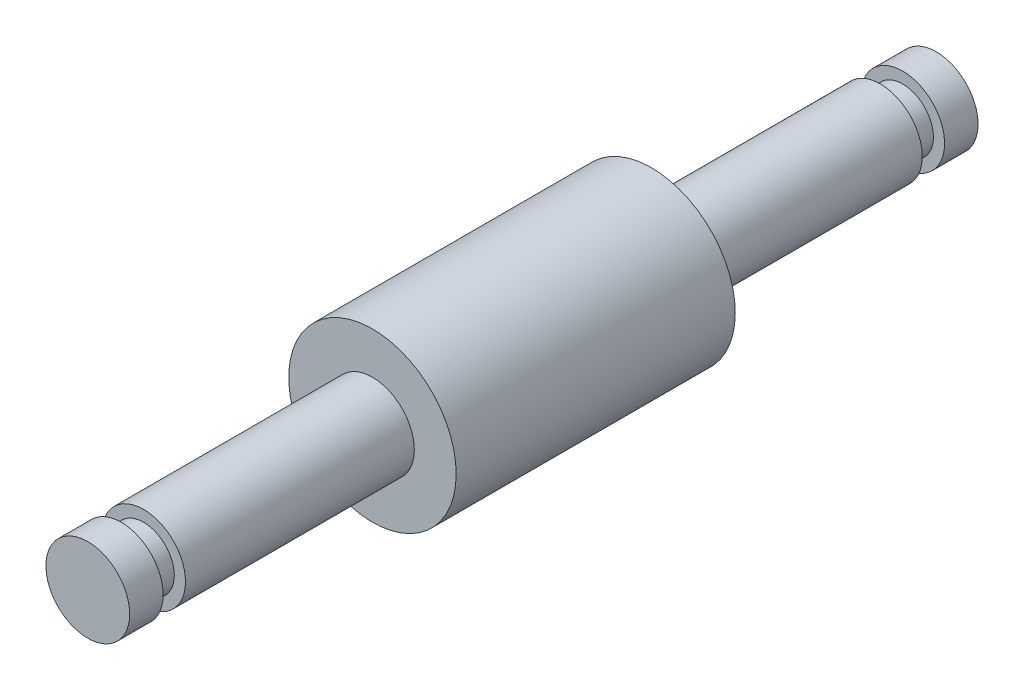
ISO-10303-21;
HEADER;
FILE_DESCRIPTION(('STEP AP214'),'2;1');
FILE_NAME('part.step','',(''),(''),'','','');
FILE_SCHEMA(('AUTOMOTIVE_DESIGN { 1 0 10303 214 1 1 1 1 }'));
ENDSEC;
DATA;
#1=APPLICATION_CONTEXT('core data for automotive mechanical design processes');
#2=APPLICATION_PROTOCOL_DEFINITION('international standard','automotive_design',2000,#1);
#3=PRODUCT_CONTEXT('',#1,'mechanical');
#4=PRODUCT('Part','Part','',(#3));
#5=PRODUCT_RELATED_PRODUCT_CATEGORY('part','',(#4));
#6=PRODUCT_DEFINITION_FORMATION('','',#4);
#7=PRODUCT_DEFINITION_CONTEXT('part definition',#1,'design');
#8=PRODUCT_DEFINITION('design','',#6,#7);
#9=PRODUCT_DEFINITION_SHAPE('','',#8);
#10=(LENGTH_UNIT() NAMED_UNIT(*) SI_UNIT(.MILLI.,.METRE.));
#11=(NAMED_UNIT(*) PLANE_ANGLE_UNIT() SI_UNIT($,.RADIAN.));
#12=(NAMED_UNIT(*) SI_UNIT($,.STERADIAN.) SOLID_ANGLE_UNIT());
#13=UNCERTAINTY_MEASURE_WITH_UNIT(LENGTH_MEASURE(1.E-05),#10,'distance_accuracy_value','');
#14=(GEOMETRIC_REPRESENTATION_CONTEXT(3) GLOBAL_UNCERTAINTY_ASSIGNED_CONTEXT((#13)) GLOBAL_UNIT_ASSIGNED_CONTEXT((#10,
#11,#12)) REPRESENTATION_CONTEXT('',''));
#15=CARTESIAN_POINT('',(0.,0.,0.));
#16=DIRECTION('',(0.,0.,1.));
#17=DIRECTION('',(1.,0.,0.));
#18=AXIS2_PLACEMENT_3D('',#15,#16,#17);
#19=CARTESIAN_POINT('',(0.,0.,25.));
#20=DIRECTION('',(0.,0.,-1.));
#21=DIRECTION('',(-1.,0.,0.));
#22=AXIS2_PLACEMENT_3D('',#19,#20,#21);
#23=CYLINDRICAL_SURFACE('',#22,15.);
#24=CARTESIAN_POINT('',(0.,0.,25.));
#25=DIRECTION('',(0.,0.,1.));
#26=DIRECTION('',(1.,0.,0.));
#27=AXIS2_PLACEMENT_3D('',#24,#25,#26);
#28=CIRCLE('',#27,15.);
#29=CARTESIAN_POINT('',(15.,0.,25.));
#30=VERTEX_POINT('',#29);
#31=EDGE_CURVE('E89',#30,#30,#28,.T.);
#32=ORIENTED_EDGE('',*,*,#31,.F.);
#33=EDGE_LOOP('',(#32));
#34=FACE_BOUND('',#33,.T.);
#35=CARTESIAN_POINT('',(0.,0.,-25.));
#36=DIRECTION('',(0.,0.,1.));
#37=DIRECTION('',(1.,0.,0.));
#38=AXIS2_PLACEMENT_3D('',#35,#36,#37);
#39=CIRCLE('',#38,15.);
#40=CARTESIAN_POINT('',(15.,0.,-25.));
#41=VERTEX_POINT('',#40);
#42=EDGE_CURVE('E46',#41,#41,#39,.T.);
#43=ORIENTED_EDGE('',*,*,#42,.T.);
#44=EDGE_LOOP('',(#43));
#45=FACE_BOUND('',#44,.T.);
#46=ADVANCED_FACE('F43',(#34,#45),#23,.T.);
#47=CARTESIAN_POINT('',(0.,0.,25.));
#48=DIRECTION('',(0.,0.,1.));
#49=DIRECTION('',(1.,0.,0.));
#50=AXIS2_PLACEMENT_3D('',#47,#48,#49);
#51=PLANE('',#50);
#52=CARTESIAN_POINT('',(0.,0.,25.));
#53=DIRECTION('',(0.,0.,1.));
#54=DIRECTION('',(1.,0.,0.));
#55=AXIS2_PLACEMENT_3D('',#52,#53,#54);
#56=CIRCLE('',#55,7.5);
#57=CARTESIAN_POINT('',(7.5,0.,25.));
#58=VERTEX_POINT('',#57);
#59=EDGE_CURVE('E83',#58,#58,#56,.T.);
#60=ORIENTED_EDGE('',*,*,#59,.F.);
#61=EDGE_LOOP('',(#60));
#62=FACE_BOUND('',#61,.T.);
#63=ORIENTED_EDGE('',*,*,#31,.T.);
#64=EDGE_LOOP('',(#63));
#65=FACE_BOUND('',#64,.T.);
#66=ADVANCED_FACE('F102',(#62,#65),#51,.T.);
#67=CARTESIAN_POINT('',(0.,0.,-25.));
#68=DIRECTION('',(0.,0.,1.));
#69=DIRECTION('',(1.,0.,0.));
#70=AXIS2_PLACEMENT_3D('',#67,#68,#69);
#71=PLANE('',#70);
#72=CARTESIAN_POINT('',(0.,0.,-25.));
#73=DIRECTION('',(0.,0.,-1.));
#74=DIRECTION('',(-1.,0.,0.));
#75=AXIS2_PLACEMENT_3D('',#72,#73,#74);
#76=CIRCLE('',#75,7.5);
#77=CARTESIAN_POINT('',(-7.5,0.,-25.));
#78=VERTEX_POINT('',#77);
#79=EDGE_CURVE('E51',#78,#78,#76,.T.);
#80=ORIENTED_EDGE('',*,*,#79,.F.);
#81=EDGE_LOOP('',(#80));
#82=FACE_BOUND('',#81,.T.);
#83=ORIENTED_EDGE('',*,*,#42,.F.);
#84=EDGE_LOOP('',(#83));
#85=FACE_BOUND('',#84,.T.);
#86=ADVANCED_FACE('F99',(#82,#85),#71,.F.);
#87=CARTESIAN_POINT('',(0.,0.,66.));
#88=DIRECTION('',(0.,0.,-1.));
#89=DIRECTION('',(-1.,0.,0.));
#90=AXIS2_PLACEMENT_3D('',#87,#88,#89);
#91=CYLINDRICAL_SURFACE('',#90,7.5);
#92=CARTESIAN_POINT('',(0.,0.,66.));
#93=DIRECTION('',(0.,0.,1.));
#94=DIRECTION('',(1.,0.,0.));
#95=AXIS2_PLACEMENT_3D('',#92,#93,#94);
#96=CIRCLE('',#95,7.5);
#97=CARTESIAN_POINT('',(7.5,0.,66.));
#98=VERTEX_POINT('',#97);
#99=EDGE_CURVE('E79',#98,#98,#96,.T.);
#100=ORIENTED_EDGE('',*,*,#99,.F.);
#101=EDGE_LOOP('',(#100));
#102=FACE_BOUND('',#101,.T.);
#103=ORIENTED_EDGE('',*,*,#59,.T.);
#104=EDGE_LOOP('',(#103));
#105=FACE_BOUND('',#104,.T.);
#106=ADVANCED_FACE('F101',(#102,#105),#91,.T.);
#107=CARTESIAN_POINT('',(0.,0.,66.));
#108=DIRECTION('',(0.,0.,1.));
#109=DIRECTION('',(1.,0.,0.));
#110=AXIS2_PLACEMENT_3D('',#107,#108,#109);
#111=PLANE('',#110);
#112=CARTESIAN_POINT('',(0.,0.,66.));
#113=DIRECTION('',(0.,0.,1.));
#114=DIRECTION('',(1.,0.,0.));
#115=AXIS2_PLACEMENT_3D('',#112,#113,#114);
#116=CIRCLE('',#115,5.5);
#117=CARTESIAN_POINT('',(5.5,0.,66.));
#118=VERTEX_POINT('',#117);
#119=EDGE_CURVE('E57',#118,#118,#116,.T.);
#120=ORIENTED_EDGE('',*,*,#119,.F.);
#121=EDGE_LOOP('',(#120));
#122=FACE_BOUND('',#121,.T.);
#123=ORIENTED_EDGE('',*,*,#99,.T.);
#124=EDGE_LOOP('',(#123));
#125=FACE_BOUND('',#124,.T.);
#126=ADVANCED_FACE('F109',(#122,#125),#111,.T.);
#127=CARTESIAN_POINT('',(0.,0.,70.));
#128=DIRECTION('',(0.,0.,-1.));
#129=DIRECTION('',(-1.,0.,0.));
#130=AXIS2_PLACEMENT_3D('',#127,#128,#129);
#131=CYLINDRICAL_SURFACE('',#130,5.5);
#132=CARTESIAN_POINT('',(0.,0.,70.));
#133=DIRECTION('',(0.,0.,1.));
#134=DIRECTION('',(1.,0.,0.));
#135=AXIS2_PLACEMENT_3D('',#132,#133,#134);
#136=CIRCLE('',#135,5.5);
#137=CARTESIAN_POINT('',(5.5,0.,70.));
#138=VERTEX_POINT('',#137);
#139=EDGE_CURVE('E72',#138,#138,#136,.T.);
#140=ORIENTED_EDGE('',*,*,#139,.F.);
#141=EDGE_LOOP('',(#140));
#142=FACE_BOUND('',#141,.T.);
#143=ORIENTED_EDGE('',*,*,#119,.T.);
#144=EDGE_LOOP('',(#143));
#145=FACE_BOUND('',#144,.T.);
#146=ADVANCED_FACE('F137',(#142,#145),#131,.T.);
#147=CARTESIAN_POINT('',(0.,0.,76.));
#148=DIRECTION('',(0.,0.,-1.));
#149=DIRECTION('',(-1.,0.,0.));
#150=AXIS2_PLACEMENT_3D('',#147,#148,#149);
#151=CYLINDRICAL_SURFACE('',#150,7.5);
#152=CARTESIAN_POINT('',(0.,0.,76.));
#153=DIRECTION('',(0.,0.,1.));
#154=DIRECTION('',(1.,0.,0.));
#155=AXIS2_PLACEMENT_3D('',#152,#153,#154);
#156=CIRCLE('',#155,7.5);
#157=CARTESIAN_POINT('',(7.5,0.,76.));
#158=VERTEX_POINT('',#157);
#159=EDGE_CURVE('E68',#158,#158,#156,.T.);
#160=ORIENTED_EDGE('',*,*,#159,.F.);
#161=EDGE_LOOP('',(#160));
#162=FACE_BOUND('',#161,.T.);
#163=CARTESIAN_POINT('',(0.,0.,70.));
#164=DIRECTION('',(0.,0.,1.));
#165=DIRECTION('',(1.,0.,0.));
#166=AXIS2_PLACEMENT_3D('',#163,#164,#165);
#167=CIRCLE('',#166,7.5);
#168=CARTESIAN_POINT('',(7.5,0.,70.));
#169=VERTEX_POINT('',#168);
#170=EDGE_CURVE('E66',#169,#169,#167,.T.);
#171=ORIENTED_EDGE('',*,*,#170,.T.);
#172=EDGE_LOOP('',(#171));
#173=FACE_BOUND('',#172,.T.);
#174=ADVANCED_FACE('F146',(#162,#173),#151,.T.);
#175=CARTESIAN_POINT('',(0.,0.,76.));
#176=DIRECTION('',(0.,0.,1.));
#177=DIRECTION('',(1.,0.,0.));
#178=AXIS2_PLACEMENT_3D('',#175,#176,#177);
#179=PLANE('',#178);
#180=ORIENTED_EDGE('',*,*,#159,.T.);
#181=EDGE_LOOP('',(#180));
#182=FACE_BOUND('',#181,.T.);
#183=ADVANCED_FACE('F155',(#182),#179,.T.);
#184=CARTESIAN_POINT('',(0.,0.,70.));
#185=DIRECTION('',(0.,0.,1.));
#186=DIRECTION('',(1.,0.,0.));
#187=AXIS2_PLACEMENT_3D('',#184,#185,#186);
#188=PLANE('',#187);
#189=ORIENTED_EDGE('',*,*,#139,.T.);
#190=EDGE_LOOP('',(#189));
#191=FACE_BOUND('',#190,.T.);
#192=ORIENTED_EDGE('',*,*,#170,.F.);
#193=EDGE_LOOP('',(#192));
#194=FACE_BOUND('',#193,.T.);
#195=ADVANCED_FACE('F163',(#191,#194),#188,.F.);
#196=CARTESIAN_POINT('',(0.,0.,-66.));
#197=DIRECTION('',(0.,0.,1.));
#198=DIRECTION('',(1.,0.,0.));
#199=AXIS2_PLACEMENT_3D('',#196,#197,#198);
#200=CYLINDRICAL_SURFACE('',#199,7.5);
#201=CARTESIAN_POINT('',(0.,0.,-66.));
#202=DIRECTION('',(0.,0.,-1.));
#203=DIRECTION('',(-1.,0.,0.));
#204=AXIS2_PLACEMENT_3D('',#201,#202,#203);
#205=CIRCLE('',#204,7.5);
#206=CARTESIAN_POINT('',(-7.5,0.,-66.));
#207=VERTEX_POINT('',#206);
#208=EDGE_CURVE('E63',#207,#207,#205,.T.);
#209=ORIENTED_EDGE('',*,*,#208,.F.);
#210=EDGE_LOOP('',(#209));
#211=FACE_BOUND('',#210,.T.);
#212=ORIENTED_EDGE('',*,*,#79,.T.);
#213=EDGE_LOOP('',(#212));
#214=FACE_BOUND('',#213,.T.);
#215=ADVANCED_FACE('F171',(#211,#214),#200,.T.);
#216=CARTESIAN_POINT('',(0.,0.,-66.));
#217=DIRECTION('',(0.,0.,-1.));
#218=DIRECTION('',(-1.,0.,0.));
#219=AXIS2_PLACEMENT_3D('',#216,#217,#218);
#220=PLANE('',#219);
#221=CARTESIAN_POINT('',(0.,0.,-66.));
#222=DIRECTION('',(0.,0.,-1.));
#223=DIRECTION('',(-1.,0.,0.));
#224=AXIS2_PLACEMENT_3D('',#221,#222,#223);
#225=CIRCLE('',#224,5.5);
#226=CARTESIAN_POINT('',(-5.5,0.,-66.));
#227=VERTEX_POINT('',#226);
#228=EDGE_CURVE('E10',#227,#227,#225,.T.);
#229=ORIENTED_EDGE('',*,*,#228,.F.);
#230=EDGE_LOOP('',(#229));
#231=FACE_BOUND('',#230,.T.);
#232=ORIENTED_EDGE('',*,*,#208,.T.);
#233=EDGE_LOOP('',(#232));
#234=FACE_BOUND('',#233,.T.);
#235=ADVANCED_FACE('F183',(#231,#234),#220,.T.);
#236=CARTESIAN_POINT('',(0.,0.,-70.));
#237=DIRECTION('',(0.,0.,1.));
#238=DIRECTION('',(1.,0.,0.));
#239=AXIS2_PLACEMENT_3D('',#236,#237,#238);
#240=CYLINDRICAL_SURFACE('',#239,5.5);
#241=CARTESIAN_POINT('',(0.,0.,-70.));
#242=DIRECTION('',(0.,0.,-1.));
#243=DIRECTION('',(-1.,0.,0.));
#244=AXIS2_PLACEMENT_3D('',#241,#242,#243);
#245=CIRCLE('',#244,5.5);
#246=CARTESIAN_POINT('',(-5.5,0.,-70.));
#247=VERTEX_POINT('',#246);
#248=EDGE_CURVE('E61',#247,#247,#245,.T.);
#249=ORIENTED_EDGE('',*,*,#248,.F.);
#250=EDGE_LOOP('',(#249));
#251=FACE_BOUND('',#250,.T.);
#252=ORIENTED_EDGE('',*,*,#228,.T.);
#253=EDGE_LOOP('',(#252));
#254=FACE_BOUND('',#253,.T.);
#255=ADVANCED_FACE('F193',(#251,#254),#240,.T.);
#256=CARTESIAN_POINT('',(0.,0.,-76.));
#257=DIRECTION('',(0.,0.,1.));
#258=DIRECTION('',(1.,0.,0.));
#259=AXIS2_PLACEMENT_3D('',#256,#257,#258);
#260=CYLINDRICAL_SURFACE('',#259,7.5);
#261=CARTESIAN_POINT('',(0.,0.,-76.));
#262=DIRECTION('',(0.,0.,-1.));
#263=DIRECTION('',(-1.,0.,0.));
#264=AXIS2_PLACEMENT_3D('',#261,#262,#263);
#265=CIRCLE('',#264,7.5);
#266=CARTESIAN_POINT('',(-7.5,0.,-76.));
#267=VERTEX_POINT('',#266);
#268=EDGE_CURVE('E244',#267,#267,#265,.T.);
#269=ORIENTED_EDGE('',*,*,#268,.F.);
#270=EDGE_LOOP('',(#269));
#271=FACE_BOUND('',#270,.T.);
#272=CARTESIAN_POINT('',(0.,0.,-70.));
#273=DIRECTION('',(0.,0.,-1.));
#274=DIRECTION('',(-1.,0.,0.));
#275=AXIS2_PLACEMENT_3D('',#272,#273,#274);
#276=CIRCLE('',#275,7.5);
#277=CARTESIAN_POINT('',(-7.5,0.,-70.));
#278=VERTEX_POINT('',#277);
#279=EDGE_CURVE('E241',#278,#278,#276,.T.);
#280=ORIENTED_EDGE('',*,*,#279,.T.);
#281=EDGE_LOOP('',(#280));
#282=FACE_BOUND('',#281,.T.);
#283=ADVANCED_FACE('F203',(#271,#282),#260,.T.);
#284=CARTESIAN_POINT('',(0.,0.,-76.));
#285=DIRECTION('',(0.,0.,-1.));
#286=DIRECTION('',(-1.,0.,0.));
#287=AXIS2_PLACEMENT_3D('',#284,#285,#286);
#288=PLANE('',#287);
#289=ORIENTED_EDGE('',*,*,#268,.T.);
#290=EDGE_LOOP('',(#289));
#291=FACE_BOUND('',#290,.T.);
#292=ADVANCED_FACE('F213',(#291),#288,.T.);
#293=CARTESIAN_POINT('',(0.,0.,-70.));
#294=DIRECTION('',(0.,0.,-1.));
#295=DIRECTION('',(-1.,0.,0.));
#296=AXIS2_PLACEMENT_3D('',#293,#294,#295);
#297=PLANE('',#296);
#298=ORIENTED_EDGE('',*,*,#248,.T.);
#299=EDGE_LOOP('',(#298));
#300=FACE_BOUND('',#299,.T.);
#301=ORIENTED_EDGE('',*,*,#279,.F.);
#302=EDGE_LOOP('',(#301));
#303=FACE_BOUND('',#302,.T.);
#304=ADVANCED_FACE('F223',(#300,#303),#297,.F.);
#305=CLOSED_SHELL('',(#46,#66,#86,#106,#126,#146,#174,#183,#195,#215,#235,#255,#283,#292,#304));
#306=MANIFOLD_SOLID_BREP('B2',#305);
#307=ADVANCED_BREP_SHAPE_REPRESENTATION('',(#18,#306),#14);
#308=SHAPE_DEFINITION_REPRESENTATION(#9,#307);
ENDSEC;
END-ISO-10303-21;
